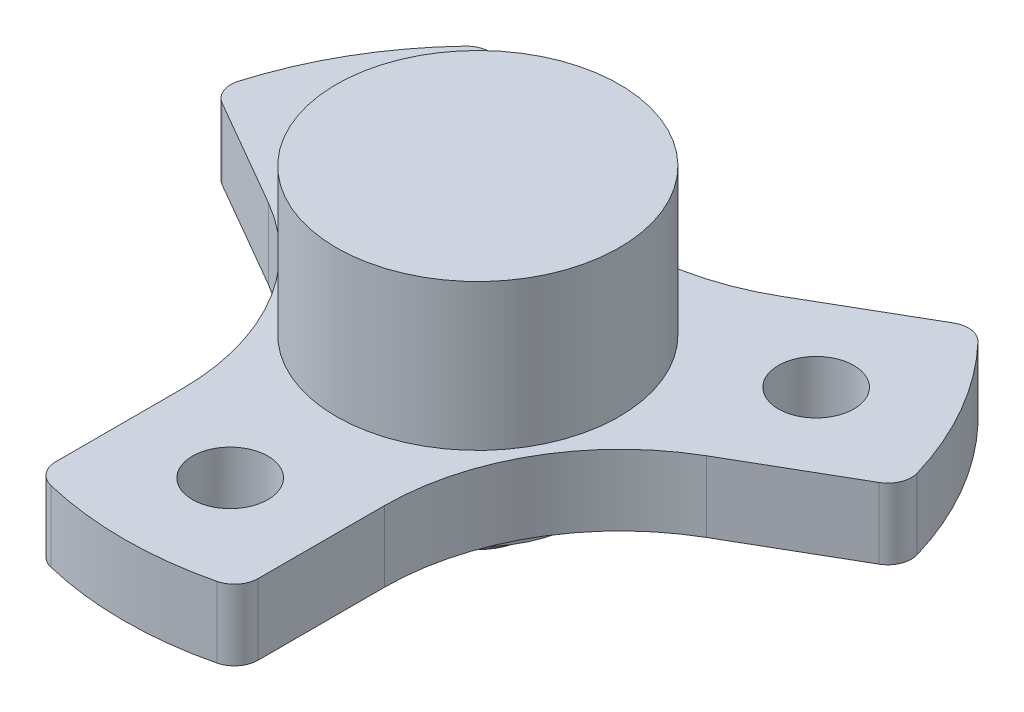
ISO-10303-21;
HEADER;
FILE_DESCRIPTION(('STEP AP214'),'2;1');
FILE_NAME('part.step','',(''),(''),'','','');
FILE_SCHEMA(('AUTOMOTIVE_DESIGN { 1 0 10303 214 1 1 1 1 }'));
ENDSEC;
DATA;
#1=APPLICATION_CONTEXT('core data for automotive mechanical design processes');
#2=APPLICATION_PROTOCOL_DEFINITION('international standard','automotive_design',2000,#1);
#3=PRODUCT_CONTEXT('',#1,'mechanical');
#4=PRODUCT('Part','Part','',(#3));
#5=PRODUCT_RELATED_PRODUCT_CATEGORY('part','',(#4));
#6=PRODUCT_DEFINITION_FORMATION('','',#4);
#7=PRODUCT_DEFINITION_CONTEXT('part definition',#1,'design');
#8=PRODUCT_DEFINITION('design','',#6,#7);
#9=PRODUCT_DEFINITION_SHAPE('','',#8);
#10=(LENGTH_UNIT() NAMED_UNIT(*) SI_UNIT(.MILLI.,.METRE.));
#11=(NAMED_UNIT(*) PLANE_ANGLE_UNIT() SI_UNIT($,.RADIAN.));
#12=(NAMED_UNIT(*) SI_UNIT($,.STERADIAN.) SOLID_ANGLE_UNIT());
#13=UNCERTAINTY_MEASURE_WITH_UNIT(LENGTH_MEASURE(1.E-05),#10,'distance_accuracy_value','');
#14=(GEOMETRIC_REPRESENTATION_CONTEXT(3) GLOBAL_UNCERTAINTY_ASSIGNED_CONTEXT((#13)) GLOBAL_UNIT_ASSIGNED_CONTEXT((#10,
#11,#12)) REPRESENTATION_CONTEXT('',''));
#15=CARTESIAN_POINT('',(0.,0.,0.));
#16=DIRECTION('',(0.,0.,1.));
#17=DIRECTION('',(1.,0.,0.));
#18=AXIS2_PLACEMENT_3D('',#15,#16,#17);
#19=CARTESIAN_POINT('',(-11.41,4.6,12.3057899789387));
#20=DIRECTION('',(0.,-1.,0.));
#21=DIRECTION('',(0.,0.,-1.));
#22=AXIS2_PLACEMENT_3D('',#19,#20,#21);
#23=PLANE('',#22);
#24=CARTESIAN_POINT('',(0.,4.6,0.));
#25=DIRECTION('',(0.,1.,0.));
#26=DIRECTION('',(0.,0.,1.));
#27=AXIS2_PLACEMENT_3D('',#24,#25,#26);
#28=CIRCLE('',#27,3.);
#29=CARTESIAN_POINT('',(0.,4.6,3.));
#30=VERTEX_POINT('',#29);
#31=EDGE_CURVE('E39',#30,#30,#28,.F.);
#32=ORIENTED_EDGE('',*,*,#31,.F.);
#33=EDGE_LOOP('',(#32));
#34=FACE_BOUND('',#33,.T.);
#35=ADVANCED_FACE('F36',(#34),#23,.F.);
#36=CARTESIAN_POINT('',(0.,-1.7,0.));
#37=DIRECTION('',(0.,-1.,0.));
#38=DIRECTION('',(0.,0.,-1.));
#39=AXIS2_PLACEMENT_3D('',#36,#37,#38);
#40=PLANE('',#39);
#41=CARTESIAN_POINT('',(0.,-1.7,0.));
#42=DIRECTION('',(0.,-1.,0.));
#43=DIRECTION('',(0.,0.,-1.));
#44=AXIS2_PLACEMENT_3D('',#41,#42,#43);
#45=CIRCLE('',#44,1.05);
#46=CARTESIAN_POINT('',(0.,-1.7,-1.05));
#47=VERTEX_POINT('',#46);
#48=EDGE_CURVE('E300',#47,#47,#45,.T.);
#49=ORIENTED_EDGE('',*,*,#48,.T.);
#50=EDGE_LOOP('',(#49));
#51=FACE_BOUND('',#50,.T.);
#52=ADVANCED_FACE('F399',(#51),#40,.T.);
#53=CARTESIAN_POINT('',(0.,-1.7,0.));
#54=DIRECTION('',(0.,1.,0.));
#55=DIRECTION('',(0.,0.,1.));
#56=AXIS2_PLACEMENT_3D('',#53,#54,#55);
#57=CONICAL_SURFACE('',#56,1.05,0.785398163397438);
#58=CARTESIAN_POINT('',(0.,-1.5,0.));
#59=DIRECTION('',(0.,-1.,0.));
#60=DIRECTION('',(0.,0.,-1.));
#61=AXIS2_PLACEMENT_3D('',#58,#59,#60);
#62=CIRCLE('',#61,1.25);
#63=CARTESIAN_POINT('',(0.,-1.5,-1.25));
#64=VERTEX_POINT('',#63);
#65=EDGE_CURVE('E303',#64,#64,#62,.F.);
#66=ORIENTED_EDGE('',*,*,#65,.F.);
#67=EDGE_LOOP('',(#66));
#68=FACE_BOUND('',#67,.T.);
#69=ORIENTED_EDGE('',*,*,#48,.F.);
#70=EDGE_LOOP('',(#69));
#71=FACE_BOUND('',#70,.T.);
#72=ADVANCED_FACE('F404',(#68,#71),#57,.T.);
#73=CARTESIAN_POINT('',(0.,-0.8,0.));
#74=DIRECTION('',(0.,-1.,0.));
#75=DIRECTION('',(0.,0.,-1.));
#76=AXIS2_PLACEMENT_3D('',#73,#74,#75);
#77=PLANE('',#76);
#78=CARTESIAN_POINT('',(0.,-0.8,0.));
#79=DIRECTION('',(0.,-1.,0.));
#80=DIRECTION('',(0.,0.,-1.));
#81=AXIS2_PLACEMENT_3D('',#78,#79,#80);
#82=CIRCLE('',#81,1.25);
#83=CARTESIAN_POINT('',(0.555555555555556,-0.8,-1.11975802059702));
#84=VERTEX_POINT('',#83);
#85=CARTESIAN_POINT('',(-0.555555555555556,-0.8,-1.11975802059702));
#86=VERTEX_POINT('',#85);
#87=EDGE_CURVE('E306',#84,#86,#82,.T.);
#88=ORIENTED_EDGE('',*,*,#87,.F.);
#89=DIRECTION('',(0.444444444444444,0.,-0.895806416477617));
#90=VECTOR('',#89,1.);
#91=CARTESIAN_POINT('',(1.,-0.8,-2.01556443707464));
#92=LINE('',#91,#90);
#93=CARTESIAN_POINT('',(1.,-0.8,-2.01556443707464));
#94=VERTEX_POINT('',#93);
#95=EDGE_CURVE('E267',#84,#94,#92,.T.);
#96=ORIENTED_EDGE('',*,*,#95,.T.);
#97=CARTESIAN_POINT('',(0.,-0.8,0.));
#98=DIRECTION('',(0.,-1.,0.));
#99=DIRECTION('',(0.,0.,-1.));
#100=AXIS2_PLACEMENT_3D('',#97,#98,#99);
#101=CIRCLE('',#100,2.25);
#102=CARTESIAN_POINT('',(-1.,-0.8,-2.01556443707464));
#103=VERTEX_POINT('',#102);
#104=EDGE_CURVE('E270',#94,#103,#101,.T.);
#105=ORIENTED_EDGE('',*,*,#104,.T.);
#106=DIRECTION('',(0.444444444444444,0.,0.895806416477617));
#107=VECTOR('',#106,1.);
#108=CARTESIAN_POINT('',(0.,-0.8,0.));
#109=LINE('',#108,#107);
#110=EDGE_CURVE('E272',#103,#86,#109,.T.);
#111=ORIENTED_EDGE('',*,*,#110,.T.);
#112=EDGE_LOOP('',(#88,#96,#105,#111));
#113=FACE_BOUND('',#112,.T.);
#114=ADVANCED_FACE('F480',(#113),#77,.T.);
#115=CARTESIAN_POINT('',(0.,-0.8,0.));
#116=DIRECTION('',(0.,1.,0.));
#117=DIRECTION('',(0.,0.,1.));
#118=AXIS2_PLACEMENT_3D('',#115,#116,#117);
#119=CYLINDRICAL_SURFACE('',#118,2.25);
#120=CARTESIAN_POINT('',(0.,0.,0.));
#121=DIRECTION('',(0.,-1.,0.));
#122=DIRECTION('',(0.,0.,-1.));
#123=AXIS2_PLACEMENT_3D('',#120,#121,#122);
#124=CIRCLE('',#123,2.25);
#125=CARTESIAN_POINT('',(1.,0.,-2.01556443707464));
#126=VERTEX_POINT('',#125);
#127=CARTESIAN_POINT('',(-1.,0.,-2.01556443707464));
#128=VERTEX_POINT('',#127);
#129=EDGE_CURVE('E276',#126,#128,#124,.T.);
#130=ORIENTED_EDGE('',*,*,#129,.T.);
#131=DIRECTION('',(0.,1.,0.));
#132=VECTOR('',#131,1.);
#133=CARTESIAN_POINT('',(-1.,-0.8,-2.01556443707464));
#134=LINE('',#133,#132);
#135=EDGE_CURVE('E274',#103,#128,#134,.T.);
#136=ORIENTED_EDGE('',*,*,#135,.F.);
#137=ORIENTED_EDGE('',*,*,#104,.F.);
#138=DIRECTION('',(0.,1.,0.));
#139=VECTOR('',#138,1.);
#140=CARTESIAN_POINT('',(1.,-0.8,-2.01556443707464));
#141=LINE('',#140,#139);
#142=EDGE_CURVE('E281',#94,#126,#141,.T.);
#143=ORIENTED_EDGE('',*,*,#142,.T.);
#144=EDGE_LOOP('',(#130,#136,#137,#143));
#145=FACE_BOUND('',#144,.T.);
#146=ADVANCED_FACE('F501',(#145),#119,.T.);
#147=CARTESIAN_POINT('',(0.,-0.8,0.));
#148=DIRECTION('',(-0.895806416477617,0.,0.444444444444444));
#149=DIRECTION('',(0.444444444444444,0.,0.895806416477617));
#150=AXIS2_PLACEMENT_3D('',#147,#148,#149);
#151=PLANE('',#150);
#152=DIRECTION('',(0.444444444444444,0.,0.895806416477617));
#153=VECTOR('',#152,1.);
#154=CARTESIAN_POINT('',(0.,0.,0.));
#155=LINE('',#154,#153);
#156=CARTESIAN_POINT('',(-0.555555555555556,0.,-1.11975802059702));
#157=VERTEX_POINT('',#156);
#158=EDGE_CURVE('E269',#128,#157,#155,.T.);
#159=ORIENTED_EDGE('',*,*,#158,.T.);
#160=DIRECTION('',(0.,1.,0.));
#161=VECTOR('',#160,1.);
#162=CARTESIAN_POINT('',(-0.555555555555556,-1.7,-1.11975802059702));
#163=LINE('',#162,#161);
#164=EDGE_CURVE('E309',#157,#86,#163,.F.);
#165=ORIENTED_EDGE('',*,*,#164,.T.);
#166=ORIENTED_EDGE('',*,*,#110,.F.);
#167=ORIENTED_EDGE('',*,*,#135,.T.);
#168=EDGE_LOOP('',(#159,#165,#166,#167));
#169=FACE_BOUND('',#168,.T.);
#170=ADVANCED_FACE('F495',(#169),#151,.F.);
#171=CARTESIAN_POINT('',(0.,-1.7,0.));
#172=DIRECTION('',(0.,1.,0.));
#173=DIRECTION('',(0.,0.,1.));
#174=AXIS2_PLACEMENT_3D('',#171,#172,#173);
#175=CYLINDRICAL_SURFACE('',#174,1.25);
#176=ORIENTED_EDGE('',*,*,#65,.T.);
#177=EDGE_LOOP('',(#176));
#178=FACE_BOUND('',#177,.T.);
#179=DIRECTION('',(0.,1.,0.));
#180=VECTOR('',#179,1.);
#181=CARTESIAN_POINT('',(0.555555555555556,-1.7,-1.11975802059702));
#182=LINE('',#181,#180);
#183=CARTESIAN_POINT('',(0.555555555555556,0.,-1.11975802059702));
#184=VERTEX_POINT('',#183);
#185=EDGE_CURVE('E312',#84,#184,#182,.T.);
#186=ORIENTED_EDGE('',*,*,#185,.F.);
#187=ORIENTED_EDGE('',*,*,#87,.T.);
#188=ORIENTED_EDGE('',*,*,#164,.F.);
#189=CARTESIAN_POINT('',(0.,0.,0.));
#190=DIRECTION('',(0.,1.,0.));
#191=DIRECTION('',(0.,0.,1.));
#192=AXIS2_PLACEMENT_3D('',#189,#190,#191);
#193=CIRCLE('',#192,1.25);
#194=EDGE_CURVE('E288',#157,#184,#193,.F.);
#195=ORIENTED_EDGE('',*,*,#194,.T.);
#196=EDGE_LOOP('',(#186,#187,#188,#195));
#197=FACE_BOUND('',#196,.T.);
#198=ADVANCED_FACE('F493',(#178,#197),#175,.T.);
#199=CARTESIAN_POINT('',(1.,-0.8,-2.01556443707464));
#200=DIRECTION('',(0.895806416477617,0.,0.444444444444444));
#201=DIRECTION('',(0.444444444444444,0.,-0.895806416477617));
#202=AXIS2_PLACEMENT_3D('',#199,#200,#201);
#203=PLANE('',#202);
#204=ORIENTED_EDGE('',*,*,#95,.F.);
#205=ORIENTED_EDGE('',*,*,#185,.T.);
#206=DIRECTION('',(0.444444444444444,0.,-0.895806416477617));
#207=VECTOR('',#206,1.);
#208=CARTESIAN_POINT('',(1.,0.,-2.01556443707464));
#209=LINE('',#208,#207);
#210=EDGE_CURVE('E266',#184,#126,#209,.T.);
#211=ORIENTED_EDGE('',*,*,#210,.T.);
#212=ORIENTED_EDGE('',*,*,#142,.F.);
#213=EDGE_LOOP('',(#204,#205,#211,#212));
#214=FACE_BOUND('',#213,.T.);
#215=ADVANCED_FACE('F486',(#214),#203,.F.);
#216=CARTESIAN_POINT('',(0.,0.,0.));
#217=DIRECTION('',(0.,1.,0.));
#218=DIRECTION('',(0.,0.,1.));
#219=AXIS2_PLACEMENT_3D('',#216,#217,#218);
#220=PLANE('',#219);
#221=CARTESIAN_POINT('',(0.,0.,5.25));
#222=DIRECTION('',(0.,-1.,0.));
#223=DIRECTION('',(0.,0.,-1.));
#224=AXIS2_PLACEMENT_3D('',#221,#222,#223);
#225=CIRCLE('',#224,0.799999999999988);
#226=CARTESIAN_POINT('',(0.,0.,4.45000000000001));
#227=VERTEX_POINT('',#226);
#228=EDGE_CURVE('E254',#227,#227,#225,.T.);
#229=ORIENTED_EDGE('',*,*,#228,.F.);
#230=EDGE_LOOP('',(#229));
#231=FACE_BOUND('',#230,.T.);
#232=ORIENTED_EDGE('',*,*,#210,.F.);
#233=ORIENTED_EDGE('',*,*,#194,.F.);
#234=ORIENTED_EDGE('',*,*,#158,.F.);
#235=ORIENTED_EDGE('',*,*,#129,.F.);
#236=EDGE_LOOP('',(#232,#233,#234,#235));
#237=FACE_BOUND('',#236,.T.);
#238=CARTESIAN_POINT('',(4.54663336986831,0.,-2.625));
#239=DIRECTION('',(0.,-1.,0.));
#240=DIRECTION('',(0.,0.,-1.));
#241=AXIS2_PLACEMENT_3D('',#238,#239,#240);
#242=CIRCLE('',#241,0.799999999999988);
#243=CARTESIAN_POINT('',(4.54663336986831,0.,-3.42499999999999));
#244=VERTEX_POINT('',#243);
#245=EDGE_CURVE('E260',#244,#244,#242,.T.);
#246=ORIENTED_EDGE('',*,*,#245,.F.);
#247=EDGE_LOOP('',(#246));
#248=FACE_BOUND('',#247,.T.);
#249=CARTESIAN_POINT('',(-4.54663336986831,0.,-2.625));
#250=DIRECTION('',(0.,-1.,0.));
#251=DIRECTION('',(0.,0.,-1.));
#252=AXIS2_PLACEMENT_3D('',#249,#250,#251);
#253=CIRCLE('',#252,0.799999999999988);
#254=CARTESIAN_POINT('',(-4.54663336986831,0.,-3.42499999999999));
#255=VERTEX_POINT('',#254);
#256=EDGE_CURVE('E248',#255,#255,#253,.T.);
#257=ORIENTED_EDGE('',*,*,#256,.F.);
#258=EDGE_LOOP('',(#257));
#259=FACE_BOUND('',#258,.T.);
#260=CARTESIAN_POINT('',(0.,0.,0.));
#261=DIRECTION('',(0.,1.,0.));
#262=DIRECTION('',(0.,0.,1.));
#263=AXIS2_PLACEMENT_3D('',#260,#261,#262);
#264=CIRCLE('',#263,7.5);
#265=CARTESIAN_POINT('',(7.19445468678419,0.,-2.11891995125087));
#266=VERTEX_POINT('',#265);
#267=CARTESIAN_POINT('',(5.43226584976103,0.,-5.17112054950569));
#268=VERTEX_POINT('',#267);
#269=EDGE_CURVE('E297',#266,#268,#264,.T.);
#270=ORIENTED_EDGE('',*,*,#269,.F.);
#271=CARTESIAN_POINT('',(6.71482437433191,0.,-1.97765862116748));
#272=DIRECTION('',(0.,1.,0.));
#273=DIRECTION('',(0.,0.,1.));
#274=AXIS2_PLACEMENT_3D('',#271,#272,#273);
#275=CIRCLE('',#274,0.5);
#276=CARTESIAN_POINT('',(6.96482437433191,0.,-1.54464591927527));
#277=VERTEX_POINT('',#276);
#278=EDGE_CURVE('E355',#266,#277,#275,.F.);
#279=ORIENTED_EDGE('',*,*,#278,.T.);
#280=DIRECTION('',(-0.866025403784439,0.,0.5));
#281=VECTOR('',#280,1.);
#282=CARTESIAN_POINT('',(4.64470958122163,0.,-0.20512701892221));
#283=LINE('',#282,#281);
#284=CARTESIAN_POINT('',(4.64470958122163,0.,-0.20512701892221));
#285=VERTEX_POINT('',#284);
#286=EDGE_CURVE('E11',#277,#285,#283,.T.);
#287=ORIENTED_EDGE('',*,*,#286,.T.);
#288=CARTESIAN_POINT('',(7.14470958122163,0.,4.125));
#289=DIRECTION('',(0.,-1.,0.));
#290=DIRECTION('',(0.,0.,-1.));
#291=AXIS2_PLACEMENT_3D('',#288,#289,#290);
#292=CIRCLE('',#291,5.);
#293=CARTESIAN_POINT('',(2.14470958122163,0.,4.125));
#294=VERTEX_POINT('',#293);
#295=EDGE_CURVE('E238',#294,#285,#292,.T.);
#296=ORIENTED_EDGE('',*,*,#295,.F.);
#297=DIRECTION('',(0.,0.,1.));
#298=VECTOR('',#297,1.);
#299=CARTESIAN_POINT('',(2.14470958122163,0.,4.125));
#300=LINE('',#299,#298);
#301=CARTESIAN_POINT('',(2.14470958122163,0.,6.80403780070612));
#302=VERTEX_POINT('',#301);
#303=EDGE_CURVE('E215',#294,#302,#300,.T.);
#304=ORIENTED_EDGE('',*,*,#303,.T.);
#305=CARTESIAN_POINT('',(1.64470958122163,0.,6.80403780070612));
#306=DIRECTION('',(0.,1.,0.));
#307=DIRECTION('',(0.,0.,1.));
#308=AXIS2_PLACEMENT_3D('',#305,#306,#307);
#309=CIRCLE('',#308,0.5);
#310=CARTESIAN_POINT('',(1.76218883702318,0.,7.29004050075656));
#311=VERTEX_POINT('',#310);
#312=EDGE_CURVE('E353',#302,#311,#309,.F.);
#313=ORIENTED_EDGE('',*,*,#312,.T.);
#314=CARTESIAN_POINT('',(-1.76218883702318,0.,7.29004050075656));
#315=VERTEX_POINT('',#314);
#316=EDGE_CURVE('E296',#315,#311,#264,.T.);
#317=ORIENTED_EDGE('',*,*,#316,.F.);
#318=CARTESIAN_POINT('',(-1.64470958122163,0.,6.80403780070612));
#319=DIRECTION('',(0.,1.,0.));
#320=DIRECTION('',(0.,0.,1.));
#321=AXIS2_PLACEMENT_3D('',#318,#319,#320);
#322=CIRCLE('',#321,0.5);
#323=CARTESIAN_POINT('',(-2.14470958122163,0.,6.80403780070612));
#324=VERTEX_POINT('',#323);
#325=EDGE_CURVE('E351',#315,#324,#322,.F.);
#326=ORIENTED_EDGE('',*,*,#325,.T.);
#327=DIRECTION('',(0.,0.,-1.));
#328=VECTOR('',#327,1.);
#329=CARTESIAN_POINT('',(-2.14470958122163,0.,11.4));
#330=LINE('',#329,#328);
#331=CARTESIAN_POINT('',(-2.14470958122163,0.,4.125));
#332=VERTEX_POINT('',#331);
#333=EDGE_CURVE('E213',#324,#332,#330,.T.);
#334=ORIENTED_EDGE('',*,*,#333,.T.);
#335=CARTESIAN_POINT('',(-7.14470958122163,0.,4.125));
#336=DIRECTION('',(0.,-1.,0.));
#337=DIRECTION('',(0.,0.,-1.));
#338=AXIS2_PLACEMENT_3D('',#335,#336,#337);
#339=CIRCLE('',#338,5.);
#340=CARTESIAN_POINT('',(-4.64470958122163,0.,-0.205127018922209));
#341=VERTEX_POINT('',#340);
#342=EDGE_CURVE('E232',#341,#332,#339,.T.);
#343=ORIENTED_EDGE('',*,*,#342,.F.);
#344=DIRECTION('',(-0.866025403784439,0.,-0.5));
#345=VECTOR('',#344,1.);
#346=CARTESIAN_POINT('',(-4.64470958122163,0.,-0.20512701892221));
#347=LINE('',#346,#345);
#348=CARTESIAN_POINT('',(-6.96482437433191,0.,-1.54464591927527));
#349=VERTEX_POINT('',#348);
#350=EDGE_CURVE('E208',#341,#349,#347,.T.);
#351=ORIENTED_EDGE('',*,*,#350,.T.);
#352=CARTESIAN_POINT('',(-6.71482437433191,0.,-1.97765862116748));
#353=DIRECTION('',(0.,1.,0.));
#354=DIRECTION('',(0.,0.,1.));
#355=AXIS2_PLACEMENT_3D('',#352,#353,#354);
#356=CIRCLE('',#355,0.5);
#357=CARTESIAN_POINT('',(-7.19445468678419,0.,-2.11891995125087));
#358=VERTEX_POINT('',#357);
#359=EDGE_CURVE('E349',#349,#358,#356,.F.);
#360=ORIENTED_EDGE('',*,*,#359,.T.);
#361=CARTESIAN_POINT('',(-5.43226584976103,0.,-5.17112054950569));
#362=VERTEX_POINT('',#361);
#363=EDGE_CURVE('E293',#362,#358,#264,.T.);
#364=ORIENTED_EDGE('',*,*,#363,.F.);
#365=CARTESIAN_POINT('',(-5.0701147931103,0.,-4.82637917953865));
#366=DIRECTION('',(0.,1.,0.));
#367=DIRECTION('',(0.,0.,1.));
#368=AXIS2_PLACEMENT_3D('',#365,#366,#367);
#369=CIRCLE('',#368,0.5);
#370=CARTESIAN_POINT('',(-4.8201147931103,0.,-5.25939188143087));
#371=VERTEX_POINT('',#370);
#372=EDGE_CURVE('E194',#362,#371,#369,.F.);
#373=ORIENTED_EDGE('',*,*,#372,.T.);
#374=DIRECTION('',(0.866025403784439,0.,0.5));
#375=VECTOR('',#374,1.);
#376=CARTESIAN_POINT('',(-8.80033481253179,0.,-7.55737298107781));
#377=LINE('',#376,#375);
#378=CARTESIAN_POINT('',(-2.5,0.,-3.91987298107781));
#379=VERTEX_POINT('',#378);
#380=EDGE_CURVE('E56',#371,#379,#377,.T.);
#381=ORIENTED_EDGE('',*,*,#380,.T.);
#382=CARTESIAN_POINT('',(0.,0.,-8.25));
#383=DIRECTION('',(0.,-1.,0.));
#384=DIRECTION('',(0.,0.,-1.));
#385=AXIS2_PLACEMENT_3D('',#382,#383,#384);
#386=CIRCLE('',#385,5.);
#387=CARTESIAN_POINT('',(2.5,0.,-3.91987298107781));
#388=VERTEX_POINT('',#387);
#389=EDGE_CURVE('E206',#388,#379,#386,.T.);
#390=ORIENTED_EDGE('',*,*,#389,.F.);
#391=DIRECTION('',(0.866025403784439,0.,-0.5));
#392=VECTOR('',#391,1.);
#393=CARTESIAN_POINT('',(8.62404483033934,0.,-7.45559191240356));
#394=LINE('',#393,#392);
#395=CARTESIAN_POINT('',(4.8201147931103,0.,-5.25939188143087));
#396=VERTEX_POINT('',#395);
#397=EDGE_CURVE('E44',#388,#396,#394,.T.);
#398=ORIENTED_EDGE('',*,*,#397,.T.);
#399=CARTESIAN_POINT('',(5.0701147931103,0.,-4.82637917953865));
#400=DIRECTION('',(0.,1.,0.));
#401=DIRECTION('',(0.,0.,1.));
#402=AXIS2_PLACEMENT_3D('',#399,#400,#401);
#403=CIRCLE('',#402,0.5);
#404=EDGE_CURVE('E184',#396,#268,#403,.F.);
#405=ORIENTED_EDGE('',*,*,#404,.T.);
#406=EDGE_LOOP('',(#270,#279,#287,#296,#304,#313,#317,#326,#334,#343,#351,#360,#364,#373,#381,
#390,#398,#405));
#407=FACE_BOUND('',#406,.T.);
#408=ADVANCED_FACE('F204',(#231,#237,#248,#259,#407),#220,.F.);
#409=CARTESIAN_POINT('',(7.14470958122163,15.801,4.125));
#410=DIRECTION('',(0.,-1.,0.));
#411=DIRECTION('',(0.,0.,-1.));
#412=AXIS2_PLACEMENT_3D('',#409,#410,#411);
#413=CYLINDRICAL_SURFACE('',#412,5.);
#414=ORIENTED_EDGE('',*,*,#295,.T.);
#415=DIRECTION('',(0.,-1.,0.));
#416=VECTOR('',#415,1.);
#417=CARTESIAN_POINT('',(4.64470958122163,15.801,-0.20512701892221));
#418=LINE('',#417,#416);
#419=CARTESIAN_POINT('',(4.64470958122163,1.5,-0.20512701892221));
#420=VERTEX_POINT('',#419);
#421=EDGE_CURVE('E323',#285,#420,#418,.F.);
#422=ORIENTED_EDGE('',*,*,#421,.T.);
#423=CARTESIAN_POINT('',(7.14470958122163,1.5,4.125));
#424=DIRECTION('',(0.,1.,0.));
#425=DIRECTION('',(0.,0.,1.));
#426=AXIS2_PLACEMENT_3D('',#423,#424,#425);
#427=CIRCLE('',#426,5.);
#428=CARTESIAN_POINT('',(2.14470958122163,1.5,4.125));
#429=VERTEX_POINT('',#428);
#430=EDGE_CURVE('E241',#429,#420,#427,.F.);
#431=ORIENTED_EDGE('',*,*,#430,.F.);
#432=DIRECTION('',(0.,-1.,0.));
#433=VECTOR('',#432,1.);
#434=CARTESIAN_POINT('',(2.14470958122163,15.801,4.125));
#435=LINE('',#434,#433);
#436=EDGE_CURVE('E320',#294,#429,#435,.F.);
#437=ORIENTED_EDGE('',*,*,#436,.F.);
#438=EDGE_LOOP('',(#414,#422,#431,#437));
#439=FACE_BOUND('',#438,.T.);
#440=ADVANCED_FACE('F429',(#439),#413,.F.);
#441=CARTESIAN_POINT('',(2.14470958122163,37.1665099143276,4.125));
#442=DIRECTION('',(1.,0.,0.));
#443=DIRECTION('',(0.,0.,-1.));
#444=AXIS2_PLACEMENT_3D('',#441,#442,#443);
#445=PLANE('',#444);
#446=DIRECTION('',(0.,0.,-1.));
#447=VECTOR('',#446,1.);
#448=CARTESIAN_POINT('',(2.14470958122163,1.5,0.));
#449=LINE('',#448,#447);
#450=CARTESIAN_POINT('',(2.14470958122163,1.5,6.80403780070612));
#451=VERTEX_POINT('',#450);
#452=EDGE_CURVE('E223',#451,#429,#449,.T.);
#453=ORIENTED_EDGE('',*,*,#452,.F.);
#454=DIRECTION('',(0.,1.,0.));
#455=VECTOR('',#454,1.);
#456=CARTESIAN_POINT('',(2.14470958122163,0.,6.80403780070612));
#457=LINE('',#456,#455);
#458=EDGE_CURVE('E357',#451,#302,#457,.F.);
#459=ORIENTED_EDGE('',*,*,#458,.T.);
#460=ORIENTED_EDGE('',*,*,#303,.F.);
#461=ORIENTED_EDGE('',*,*,#436,.T.);
#462=EDGE_LOOP('',(#453,#459,#460,#461));
#463=FACE_BOUND('',#462,.T.);
#464=ADVANCED_FACE('F425',(#463),#445,.T.);
#465=CARTESIAN_POINT('',(1.64470958122163,1.5,6.80403780070612));
#466=DIRECTION('',(0.,-1.,0.));
#467=DIRECTION('',(0.,0.,-1.));
#468=AXIS2_PLACEMENT_3D('',#465,#466,#467);
#469=CYLINDRICAL_SURFACE('',#468,0.5);
#470=CARTESIAN_POINT('',(1.64470958122163,1.5,6.80403780070612));
#471=DIRECTION('',(0.,1.,0.));
#472=DIRECTION('',(0.,0.,1.));
#473=AXIS2_PLACEMENT_3D('',#470,#471,#472);
#474=CIRCLE('',#473,0.5);
#475=CARTESIAN_POINT('',(1.76218883702318,1.5,7.29004050075656));
#476=VERTEX_POINT('',#475);
#477=EDGE_CURVE('E342',#476,#451,#474,.T.);
#478=ORIENTED_EDGE('',*,*,#477,.F.);
#479=DIRECTION('',(0.,-1.,0.));
#480=VECTOR('',#479,1.);
#481=CARTESIAN_POINT('',(1.76218883702318,1.5,7.29004050075656));
#482=LINE('',#481,#480);
#483=EDGE_CURVE('E362',#311,#476,#482,.F.);
#484=ORIENTED_EDGE('',*,*,#483,.F.);
#485=ORIENTED_EDGE('',*,*,#312,.F.);
#486=ORIENTED_EDGE('',*,*,#458,.F.);
#487=EDGE_LOOP('',(#478,#484,#485,#486));
#488=FACE_BOUND('',#487,.T.);
#489=ADVANCED_FACE('F421',(#488),#469,.T.);
#490=CARTESIAN_POINT('',(0.,1.5,0.));
#491=DIRECTION('',(0.,-1.,0.));
#492=DIRECTION('',(0.,0.,-1.));
#493=AXIS2_PLACEMENT_3D('',#490,#491,#492);
#494=CYLINDRICAL_SURFACE('',#493,7.5);
#495=ORIENTED_EDGE('',*,*,#316,.T.);
#496=ORIENTED_EDGE('',*,*,#483,.T.);
#497=CARTESIAN_POINT('',(0.,1.5,0.));
#498=DIRECTION('',(0.,1.,0.));
#499=DIRECTION('',(0.,0.,1.));
#500=AXIS2_PLACEMENT_3D('',#497,#498,#499);
#501=CIRCLE('',#500,7.5);
#502=CARTESIAN_POINT('',(-1.76218883702318,1.5,7.29004050075656));
#503=VERTEX_POINT('',#502);
#504=EDGE_CURVE('E289',#503,#476,#501,.T.);
#505=ORIENTED_EDGE('',*,*,#504,.F.);
#506=DIRECTION('',(0.,-1.,0.));
#507=VECTOR('',#506,1.);
#508=CARTESIAN_POINT('',(-1.76218883702318,1.5,7.29004050075656));
#509=LINE('',#508,#507);
#510=EDGE_CURVE('E360',#503,#315,#509,.T.);
#511=ORIENTED_EDGE('',*,*,#510,.T.);
#512=EDGE_LOOP('',(#495,#496,#505,#511));
#513=FACE_BOUND('',#512,.T.);
#514=ADVANCED_FACE('F415',(#513),#494,.T.);
#515=CARTESIAN_POINT('',(-1.64470958122163,1.5,6.80403780070612));
#516=DIRECTION('',(0.,-1.,0.));
#517=DIRECTION('',(0.,0.,-1.));
#518=AXIS2_PLACEMENT_3D('',#515,#516,#517);
#519=CYLINDRICAL_SURFACE('',#518,0.5);
#520=ORIENTED_EDGE('',*,*,#325,.F.);
#521=ORIENTED_EDGE('',*,*,#510,.F.);
#522=CARTESIAN_POINT('',(-1.64470958122163,1.5,6.80403780070612));
#523=DIRECTION('',(0.,1.,0.));
#524=DIRECTION('',(0.,0.,1.));
#525=AXIS2_PLACEMENT_3D('',#522,#523,#524);
#526=CIRCLE('',#525,0.5);
#527=CARTESIAN_POINT('',(-2.14470958122163,1.5,6.80403780070612));
#528=VERTEX_POINT('',#527);
#529=EDGE_CURVE('E340',#528,#503,#526,.T.);
#530=ORIENTED_EDGE('',*,*,#529,.F.);
#531=DIRECTION('',(0.,1.,0.));
#532=VECTOR('',#531,1.);
#533=CARTESIAN_POINT('',(-2.14470958122163,1.5,6.80403780070612));
#534=LINE('',#533,#532);
#535=EDGE_CURVE('E364',#324,#528,#534,.T.);
#536=ORIENTED_EDGE('',*,*,#535,.F.);
#537=EDGE_LOOP('',(#520,#521,#530,#536));
#538=FACE_BOUND('',#537,.T.);
#539=ADVANCED_FACE('F462',(#538),#519,.T.);
#540=CARTESIAN_POINT('',(-2.14470958122163,37.1665099143276,11.4));
#541=DIRECTION('',(-1.,0.,0.));
#542=DIRECTION('',(0.,0.,1.));
#543=AXIS2_PLACEMENT_3D('',#540,#541,#542);
#544=PLANE('',#543);
#545=ORIENTED_EDGE('',*,*,#333,.F.);
#546=ORIENTED_EDGE('',*,*,#535,.T.);
#547=DIRECTION('',(0.,0.,1.));
#548=VECTOR('',#547,1.);
#549=CARTESIAN_POINT('',(-2.14470958122163,1.5,0.));
#550=LINE('',#549,#548);
#551=CARTESIAN_POINT('',(-2.14470958122163,1.5,4.125));
#552=VERTEX_POINT('',#551);
#553=EDGE_CURVE('E218',#552,#528,#550,.T.);
#554=ORIENTED_EDGE('',*,*,#553,.F.);
#555=DIRECTION('',(0.,-1.,0.));
#556=VECTOR('',#555,1.);
#557=CARTESIAN_POINT('',(-2.14470958122163,15.801,4.125));
#558=LINE('',#557,#556);
#559=EDGE_CURVE('E314',#332,#552,#558,.F.);
#560=ORIENTED_EDGE('',*,*,#559,.F.);
#561=EDGE_LOOP('',(#545,#546,#554,#560));
#562=FACE_BOUND('',#561,.T.);
#563=ADVANCED_FACE('F459',(#562),#544,.T.);
#564=CARTESIAN_POINT('',(-7.14470958122163,15.801,4.125));
#565=DIRECTION('',(0.,-1.,0.));
#566=DIRECTION('',(0.,0.,-1.));
#567=AXIS2_PLACEMENT_3D('',#564,#565,#566);
#568=CYLINDRICAL_SURFACE('',#567,5.);
#569=DIRECTION('',(0.,-1.,0.));
#570=VECTOR('',#569,1.);
#571=CARTESIAN_POINT('',(-4.64470958122163,15.801,-0.205127018922209));
#572=LINE('',#571,#570);
#573=CARTESIAN_POINT('',(-4.64470958122163,1.5,-0.20512701892221));
#574=VERTEX_POINT('',#573);
#575=EDGE_CURVE('E317',#341,#574,#572,.F.);
#576=ORIENTED_EDGE('',*,*,#575,.F.);
#577=ORIENTED_EDGE('',*,*,#342,.T.);
#578=ORIENTED_EDGE('',*,*,#559,.T.);
#579=CARTESIAN_POINT('',(-7.14470958122163,1.5,4.125));
#580=DIRECTION('',(0.,1.,0.));
#581=DIRECTION('',(0.,0.,1.));
#582=AXIS2_PLACEMENT_3D('',#579,#580,#581);
#583=CIRCLE('',#582,5.);
#584=EDGE_CURVE('E235',#574,#552,#583,.F.);
#585=ORIENTED_EDGE('',*,*,#584,.F.);
#586=EDGE_LOOP('',(#576,#577,#578,#585));
#587=FACE_BOUND('',#586,.T.);
#588=ADVANCED_FACE('F456',(#587),#568,.F.);
#589=CARTESIAN_POINT('',(-4.64470958122163,37.1665099143276,-0.20512701892221));
#590=DIRECTION('',(-0.5,0.,0.866025403784439));
#591=DIRECTION('',(0.866025403784439,0.,0.5));
#592=AXIS2_PLACEMENT_3D('',#589,#590,#591);
#593=PLANE('',#592);
#594=DIRECTION('',(0.866025403784439,0.,0.5));
#595=VECTOR('',#594,1.);
#596=CARTESIAN_POINT('',(-1.0723547906108,1.5,1.8573729810778));
#597=LINE('',#596,#595);
#598=CARTESIAN_POINT('',(-6.96482437433191,1.5,-1.54464591927527));
#599=VERTEX_POINT('',#598);
#600=EDGE_CURVE('E221',#599,#574,#597,.T.);
#601=ORIENTED_EDGE('',*,*,#600,.F.);
#602=DIRECTION('',(0.,1.,0.));
#603=VECTOR('',#602,1.);
#604=CARTESIAN_POINT('',(-6.96482437433191,0.,-1.54464591927527));
#605=LINE('',#604,#603);
#606=EDGE_CURVE('E367',#599,#349,#605,.F.);
#607=ORIENTED_EDGE('',*,*,#606,.T.);
#608=ORIENTED_EDGE('',*,*,#350,.F.);
#609=ORIENTED_EDGE('',*,*,#575,.T.);
#610=EDGE_LOOP('',(#601,#607,#608,#609));
#611=FACE_BOUND('',#610,.T.);
#612=ADVANCED_FACE('F449',(#611),#593,.T.);
#613=CARTESIAN_POINT('',(-6.71482437433191,1.5,-1.97765862116748));
#614=DIRECTION('',(0.,-1.,0.));
#615=DIRECTION('',(0.,0.,-1.));
#616=AXIS2_PLACEMENT_3D('',#613,#614,#615);
#617=CYLINDRICAL_SURFACE('',#616,0.5);
#618=CARTESIAN_POINT('',(-6.71482437433191,1.5,-1.97765862116748));
#619=DIRECTION('',(0.,1.,0.));
#620=DIRECTION('',(0.,0.,1.));
#621=AXIS2_PLACEMENT_3D('',#618,#619,#620);
#622=CIRCLE('',#621,0.5);
#623=CARTESIAN_POINT('',(-7.19445468678419,1.5,-2.11891995125087));
#624=VERTEX_POINT('',#623);
#625=EDGE_CURVE('E338',#624,#599,#622,.T.);
#626=ORIENTED_EDGE('',*,*,#625,.F.);
#627=DIRECTION('',(0.,-1.,0.));
#628=VECTOR('',#627,1.);
#629=CARTESIAN_POINT('',(-7.19445468678419,1.5,-2.11891995125087));
#630=LINE('',#629,#628);
#631=EDGE_CURVE('E372',#358,#624,#630,.F.);
#632=ORIENTED_EDGE('',*,*,#631,.F.);
#633=ORIENTED_EDGE('',*,*,#359,.F.);
#634=ORIENTED_EDGE('',*,*,#606,.F.);
#635=EDGE_LOOP('',(#626,#632,#633,#634));
#636=FACE_BOUND('',#635,.T.);
#637=ADVANCED_FACE('F447',(#636),#617,.T.);
#638=ORIENTED_EDGE('',*,*,#363,.T.);
#639=ORIENTED_EDGE('',*,*,#631,.T.);
#640=CARTESIAN_POINT('',(-5.43226584976103,1.5,-5.17112054950569));
#641=VERTEX_POINT('',#640);
#642=EDGE_CURVE('E287',#641,#624,#501,.T.);
#643=ORIENTED_EDGE('',*,*,#642,.F.);
#644=DIRECTION('',(0.,-1.,0.));
#645=VECTOR('',#644,1.);
#646=CARTESIAN_POINT('',(-5.43226584976103,1.5,-5.17112054950569));
#647=LINE('',#646,#645);
#648=EDGE_CURVE('E370',#641,#362,#647,.T.);
#649=ORIENTED_EDGE('',*,*,#648,.T.);
#650=EDGE_LOOP('',(#638,#639,#643,#649));
#651=FACE_BOUND('',#650,.T.);
#652=ADVANCED_FACE('F471',(#651),#494,.T.);
#653=CARTESIAN_POINT('',(-5.0701147931103,1.5,-4.82637917953865));
#654=DIRECTION('',(0.,-1.,0.));
#655=DIRECTION('',(0.,0.,-1.));
#656=AXIS2_PLACEMENT_3D('',#653,#654,#655);
#657=CYLINDRICAL_SURFACE('',#656,0.5);
#658=ORIENTED_EDGE('',*,*,#372,.F.);
#659=ORIENTED_EDGE('',*,*,#648,.F.);
#660=CARTESIAN_POINT('',(-5.0701147931103,1.5,-4.82637917953865));
#661=DIRECTION('',(0.,1.,0.));
#662=DIRECTION('',(0.,0.,1.));
#663=AXIS2_PLACEMENT_3D('',#660,#661,#662);
#664=CIRCLE('',#663,0.5);
#665=CARTESIAN_POINT('',(-4.8201147931103,1.5,-5.25939188143087));
#666=VERTEX_POINT('',#665);
#667=EDGE_CURVE('E336',#666,#641,#664,.T.);
#668=ORIENTED_EDGE('',*,*,#667,.F.);
#669=DIRECTION('',(0.,1.,0.));
#670=VECTOR('',#669,1.);
#671=CARTESIAN_POINT('',(-4.82011479311029,1.5,-5.25939188143087));
#672=LINE('',#671,#670);
#673=EDGE_CURVE('E202',#371,#666,#672,.T.);
#674=ORIENTED_EDGE('',*,*,#673,.F.);
#675=EDGE_LOOP('',(#658,#659,#668,#674));
#676=FACE_BOUND('',#675,.T.);
#677=ADVANCED_FACE('F394',(#676),#657,.T.);
#678=CARTESIAN_POINT('',(-8.80033481253179,37.1665099143276,-7.55737298107781));
#679=DIRECTION('',(0.5,0.,-0.866025403784439));
#680=DIRECTION('',(-0.866025403784439,0.,-0.5));
#681=AXIS2_PLACEMENT_3D('',#678,#679,#680);
#682=PLANE('',#681);
#683=ORIENTED_EDGE('',*,*,#380,.F.);
#684=ORIENTED_EDGE('',*,*,#673,.T.);
#685=DIRECTION('',(-0.866025403784439,0.,-0.5));
#686=VECTOR('',#685,1.);
#687=CARTESIAN_POINT('',(1.07235479061081,1.5,-1.8573729810778));
#688=LINE('',#687,#686);
#689=CARTESIAN_POINT('',(-2.5,1.5,-3.91987298107781));
#690=VERTEX_POINT('',#689);
#691=EDGE_CURVE('E228',#690,#666,#688,.T.);
#692=ORIENTED_EDGE('',*,*,#691,.F.);
#693=DIRECTION('',(0.,-1.,0.));
#694=VECTOR('',#693,1.);
#695=CARTESIAN_POINT('',(-2.5,15.801,-3.91987298107781));
#696=LINE('',#695,#694);
#697=EDGE_CURVE('E326',#379,#690,#696,.F.);
#698=ORIENTED_EDGE('',*,*,#697,.F.);
#699=EDGE_LOOP('',(#683,#684,#692,#698));
#700=FACE_BOUND('',#699,.T.);
#701=ADVANCED_FACE('F377',(#700),#682,.T.);
#702=CARTESIAN_POINT('',(0.,15.801,-8.25));
#703=DIRECTION('',(0.,-1.,0.));
#704=DIRECTION('',(0.,0.,-1.));
#705=AXIS2_PLACEMENT_3D('',#702,#703,#704);
#706=CYLINDRICAL_SURFACE('',#705,5.);
#707=DIRECTION('',(0.,-1.,0.));
#708=VECTOR('',#707,1.);
#709=CARTESIAN_POINT('',(2.5,15.801,-3.91987298107781));
#710=LINE('',#709,#708);
#711=CARTESIAN_POINT('',(2.5,1.5,-3.91987298107781));
#712=VERTEX_POINT('',#711);
#713=EDGE_CURVE('E329',#388,#712,#710,.F.);
#714=ORIENTED_EDGE('',*,*,#713,.F.);
#715=ORIENTED_EDGE('',*,*,#389,.T.);
#716=ORIENTED_EDGE('',*,*,#697,.T.);
#717=CARTESIAN_POINT('',(0.,1.5,-8.25));
#718=DIRECTION('',(0.,1.,0.));
#719=DIRECTION('',(0.,0.,1.));
#720=AXIS2_PLACEMENT_3D('',#717,#718,#719);
#721=CIRCLE('',#720,5.);
#722=EDGE_CURVE('E245',#712,#690,#721,.F.);
#723=ORIENTED_EDGE('',*,*,#722,.F.);
#724=EDGE_LOOP('',(#714,#715,#716,#723));
#725=FACE_BOUND('',#724,.T.);
#726=ADVANCED_FACE('F386',(#725),#706,.F.);
#727=CARTESIAN_POINT('',(8.62404483033934,37.1665099143276,-7.45559191240356));
#728=DIRECTION('',(-0.5,0.,-0.866025403784439));
#729=DIRECTION('',(-0.866025403784439,0.,0.5));
#730=AXIS2_PLACEMENT_3D('',#727,#728,#729);
#731=PLANE('',#730);
#732=DIRECTION('',(-0.866025403784439,0.,0.5));
#733=VECTOR('',#732,1.);
#734=CARTESIAN_POINT('',(-1.07235479061081,1.5,-1.85737298107781));
#735=LINE('',#734,#733);
#736=CARTESIAN_POINT('',(4.8201147931103,1.5,-5.25939188143087));
#737=VERTEX_POINT('',#736);
#738=EDGE_CURVE('E201',#737,#712,#735,.T.);
#739=ORIENTED_EDGE('',*,*,#738,.F.);
#740=DIRECTION('',(0.,1.,0.));
#741=VECTOR('',#740,1.);
#742=CARTESIAN_POINT('',(4.8201147931103,0.,-5.25939188143087));
#743=LINE('',#742,#741);
#744=EDGE_CURVE('E188',#737,#396,#743,.F.);
#745=ORIENTED_EDGE('',*,*,#744,.T.);
#746=ORIENTED_EDGE('',*,*,#397,.F.);
#747=ORIENTED_EDGE('',*,*,#713,.T.);
#748=EDGE_LOOP('',(#739,#745,#746,#747));
#749=FACE_BOUND('',#748,.T.);
#750=ADVANCED_FACE('F198',(#749),#731,.T.);
#751=CARTESIAN_POINT('',(5.0701147931103,1.5,-4.82637917953865));
#752=DIRECTION('',(0.,-1.,0.));
#753=DIRECTION('',(0.,0.,-1.));
#754=AXIS2_PLACEMENT_3D('',#751,#752,#753);
#755=CYLINDRICAL_SURFACE('',#754,0.5);
#756=CARTESIAN_POINT('',(5.0701147931103,1.5,-4.82637917953865));
#757=DIRECTION('',(0.,1.,0.));
#758=DIRECTION('',(0.,0.,1.));
#759=AXIS2_PLACEMENT_3D('',#756,#757,#758);
#760=CIRCLE('',#759,0.5);
#761=CARTESIAN_POINT('',(5.43226584976103,1.5,-5.17112054950569));
#762=VERTEX_POINT('',#761);
#763=EDGE_CURVE('E334',#762,#737,#760,.T.);
#764=ORIENTED_EDGE('',*,*,#763,.F.);
#765=DIRECTION('',(0.,-1.,0.));
#766=VECTOR('',#765,1.);
#767=CARTESIAN_POINT('',(5.43226584976103,1.5,-5.17112054950569));
#768=LINE('',#767,#766);
#769=EDGE_CURVE('E189',#268,#762,#768,.F.);
#770=ORIENTED_EDGE('',*,*,#769,.F.);
#771=ORIENTED_EDGE('',*,*,#404,.F.);
#772=ORIENTED_EDGE('',*,*,#744,.F.);
#773=EDGE_LOOP('',(#764,#770,#771,#772));
#774=FACE_BOUND('',#773,.T.);
#775=ADVANCED_FACE('F187',(#774),#755,.T.);
#776=CARTESIAN_POINT('',(7.19445468678419,1.5,-2.11891995125087));
#777=VERTEX_POINT('',#776);
#778=EDGE_CURVE('E292',#777,#762,#501,.T.);
#779=ORIENTED_EDGE('',*,*,#778,.F.);
#780=DIRECTION('',(0.,-1.,0.));
#781=VECTOR('',#780,1.);
#782=CARTESIAN_POINT('',(7.19445468678419,1.5,-2.11891995125087));
#783=LINE('',#782,#781);
#784=EDGE_CURVE('E193',#777,#266,#783,.T.);
#785=ORIENTED_EDGE('',*,*,#784,.T.);
#786=ORIENTED_EDGE('',*,*,#269,.T.);
#787=ORIENTED_EDGE('',*,*,#769,.T.);
#788=EDGE_LOOP('',(#779,#785,#786,#787));
#789=FACE_BOUND('',#788,.T.);
#790=ADVANCED_FACE('F439',(#789),#494,.T.);
#791=CARTESIAN_POINT('',(6.71482437433191,1.5,-1.97765862116748));
#792=DIRECTION('',(0.,-1.,0.));
#793=DIRECTION('',(0.,0.,-1.));
#794=AXIS2_PLACEMENT_3D('',#791,#792,#793);
#795=CYLINDRICAL_SURFACE('',#794,0.5);
#796=ORIENTED_EDGE('',*,*,#278,.F.);
#797=ORIENTED_EDGE('',*,*,#784,.F.);
#798=CARTESIAN_POINT('',(6.71482437433191,1.5,-1.97765862116748));
#799=DIRECTION('',(0.,1.,0.));
#800=DIRECTION('',(0.,0.,1.));
#801=AXIS2_PLACEMENT_3D('',#798,#799,#800);
#802=CIRCLE('',#801,0.5);
#803=CARTESIAN_POINT('',(6.96482437433191,1.5,-1.54464591927527));
#804=VERTEX_POINT('',#803);
#805=EDGE_CURVE('E344',#804,#777,#802,.T.);
#806=ORIENTED_EDGE('',*,*,#805,.F.);
#807=DIRECTION('',(0.,1.,0.));
#808=VECTOR('',#807,1.);
#809=CARTESIAN_POINT('',(6.96482437433191,1.5,-1.54464591927527));
#810=LINE('',#809,#808);
#811=EDGE_CURVE('E331',#277,#804,#810,.T.);
#812=ORIENTED_EDGE('',*,*,#811,.F.);
#813=EDGE_LOOP('',(#796,#797,#806,#812));
#814=FACE_BOUND('',#813,.T.);
#815=ADVANCED_FACE('F437',(#814),#795,.T.);
#816=CARTESIAN_POINT('',(4.64470958122163,37.1665099143276,-0.20512701892221));
#817=DIRECTION('',(0.5,0.,0.866025403784439));
#818=DIRECTION('',(0.866025403784439,0.,-0.5));
#819=AXIS2_PLACEMENT_3D('',#816,#817,#818);
#820=PLANE('',#819);
#821=ORIENTED_EDGE('',*,*,#286,.F.);
#822=ORIENTED_EDGE('',*,*,#811,.T.);
#823=DIRECTION('',(0.866025403784439,0.,-0.5));
#824=VECTOR('',#823,1.);
#825=CARTESIAN_POINT('',(1.0723547906108,1.5,1.8573729810778));
#826=LINE('',#825,#824);
#827=EDGE_CURVE('E225',#420,#804,#826,.T.);
#828=ORIENTED_EDGE('',*,*,#827,.F.);
#829=ORIENTED_EDGE('',*,*,#421,.F.);
#830=EDGE_LOOP('',(#821,#822,#828,#829));
#831=FACE_BOUND('',#830,.T.);
#832=ADVANCED_FACE('F433',(#831),#820,.T.);
#833=CARTESIAN_POINT('',(4.54663336986831,0.,-2.625));
#834=DIRECTION('',(0.,-1.,0.));
#835=DIRECTION('',(0.,0.,-1.));
#836=AXIS2_PLACEMENT_3D('',#833,#834,#835);
#837=CYLINDRICAL_SURFACE('',#836,0.8);
#838=ORIENTED_EDGE('',*,*,#245,.T.);
#839=EDGE_LOOP('',(#838));
#840=FACE_BOUND('',#839,.T.);
#841=CARTESIAN_POINT('',(4.54663336986831,1.5,-2.625));
#842=DIRECTION('',(0.,1.,0.));
#843=DIRECTION('',(0.,0.,1.));
#844=AXIS2_PLACEMENT_3D('',#841,#842,#843);
#845=CIRCLE('',#844,0.8);
#846=CARTESIAN_POINT('',(4.54663336986831,1.5,-1.825));
#847=VERTEX_POINT('',#846);
#848=EDGE_CURVE('E263',#847,#847,#845,.T.);
#849=ORIENTED_EDGE('',*,*,#848,.T.);
#850=EDGE_LOOP('',(#849));
#851=FACE_BOUND('',#850,.T.);
#852=ADVANCED_FACE('F511',(#840,#851),#837,.F.);
#853=CARTESIAN_POINT('',(0.,0.,5.25));
#854=DIRECTION('',(0.,-1.,0.));
#855=DIRECTION('',(0.,0.,-1.));
#856=AXIS2_PLACEMENT_3D('',#853,#854,#855);
#857=CYLINDRICAL_SURFACE('',#856,0.8);
#858=ORIENTED_EDGE('',*,*,#228,.T.);
#859=EDGE_LOOP('',(#858));
#860=FACE_BOUND('',#859,.T.);
#861=CARTESIAN_POINT('',(0.,1.5,5.25));
#862=DIRECTION('',(0.,1.,0.));
#863=DIRECTION('',(0.,0.,1.));
#864=AXIS2_PLACEMENT_3D('',#861,#862,#863);
#865=CIRCLE('',#864,0.8);
#866=CARTESIAN_POINT('',(0.,1.5,6.05));
#867=VERTEX_POINT('',#866);
#868=EDGE_CURVE('E257',#867,#867,#865,.T.);
#869=ORIENTED_EDGE('',*,*,#868,.T.);
#870=EDGE_LOOP('',(#869));
#871=FACE_BOUND('',#870,.T.);
#872=ADVANCED_FACE('F514',(#860,#871),#857,.F.);
#873=CARTESIAN_POINT('',(-4.54663336986831,0.,-2.625));
#874=DIRECTION('',(0.,-1.,0.));
#875=DIRECTION('',(0.,0.,-1.));
#876=AXIS2_PLACEMENT_3D('',#873,#874,#875);
#877=CYLINDRICAL_SURFACE('',#876,0.8);
#878=ORIENTED_EDGE('',*,*,#256,.T.);
#879=EDGE_LOOP('',(#878));
#880=FACE_BOUND('',#879,.T.);
#881=CARTESIAN_POINT('',(-4.54663336986831,1.5,-2.625));
#882=DIRECTION('',(0.,1.,0.));
#883=DIRECTION('',(0.,0.,1.));
#884=AXIS2_PLACEMENT_3D('',#881,#882,#883);
#885=CIRCLE('',#884,0.8);
#886=CARTESIAN_POINT('',(-4.54663336986831,1.5,-1.825));
#887=VERTEX_POINT('',#886);
#888=EDGE_CURVE('E251',#887,#887,#885,.T.);
#889=ORIENTED_EDGE('',*,*,#888,.T.);
#890=EDGE_LOOP('',(#889));
#891=FACE_BOUND('',#890,.T.);
#892=ADVANCED_FACE('F491',(#880,#891),#877,.F.);
#893=CARTESIAN_POINT('',(0.,1.5,0.));
#894=DIRECTION('',(0.,1.,0.));
#895=DIRECTION('',(0.,0.,1.));
#896=AXIS2_PLACEMENT_3D('',#893,#894,#895);
#897=PLANE('',#896);
#898=ORIENTED_EDGE('',*,*,#888,.F.);
#899=EDGE_LOOP('',(#898));
#900=FACE_BOUND('',#899,.T.);
#901=ORIENTED_EDGE('',*,*,#868,.F.);
#902=EDGE_LOOP('',(#901));
#903=FACE_BOUND('',#902,.T.);
#904=ORIENTED_EDGE('',*,*,#848,.F.);
#905=EDGE_LOOP('',(#904));
#906=FACE_BOUND('',#905,.T.);
#907=CARTESIAN_POINT('',(0.,1.5,0.));
#908=DIRECTION('',(0.,1.,0.));
#909=DIRECTION('',(0.,0.,1.));
#910=AXIS2_PLACEMENT_3D('',#907,#908,#909);
#911=CIRCLE('',#910,3.);
#912=CARTESIAN_POINT('',(0.,1.5,3.));
#913=VERTEX_POINT('',#912);
#914=EDGE_CURVE('E284',#913,#913,#911,.T.);
#915=ORIENTED_EDGE('',*,*,#914,.F.);
#916=EDGE_LOOP('',(#915));
#917=FACE_BOUND('',#916,.T.);
#918=ORIENTED_EDGE('',*,*,#827,.T.);
#919=ORIENTED_EDGE('',*,*,#805,.T.);
#920=ORIENTED_EDGE('',*,*,#778,.T.);
#921=ORIENTED_EDGE('',*,*,#763,.T.);
#922=ORIENTED_EDGE('',*,*,#738,.T.);
#923=ORIENTED_EDGE('',*,*,#722,.T.);
#924=ORIENTED_EDGE('',*,*,#691,.T.);
#925=ORIENTED_EDGE('',*,*,#667,.T.);
#926=ORIENTED_EDGE('',*,*,#642,.T.);
#927=ORIENTED_EDGE('',*,*,#625,.T.);
#928=ORIENTED_EDGE('',*,*,#600,.T.);
#929=ORIENTED_EDGE('',*,*,#584,.T.);
#930=ORIENTED_EDGE('',*,*,#553,.T.);
#931=ORIENTED_EDGE('',*,*,#529,.T.);
#932=ORIENTED_EDGE('',*,*,#504,.T.);
#933=ORIENTED_EDGE('',*,*,#477,.T.);
#934=ORIENTED_EDGE('',*,*,#452,.T.);
#935=ORIENTED_EDGE('',*,*,#430,.T.);
#936=EDGE_LOOP('',(#918,#919,#920,#921,#922,#923,#924,#925,#926,#927,#928,#929,#930,#931,#932,
#933,#934,#935));
#937=FACE_BOUND('',#936,.T.);
#938=ADVANCED_FACE('F381',(#900,#903,#906,#917,#937),#897,.T.);
#939=CARTESIAN_POINT('',(0.,15.8,0.));
#940=DIRECTION('',(0.,-1.,0.));
#941=DIRECTION('',(0.,0.,-1.));
#942=AXIS2_PLACEMENT_3D('',#939,#940,#941);
#943=CYLINDRICAL_SURFACE('',#942,3.);
#944=ORIENTED_EDGE('',*,*,#914,.T.);
#945=EDGE_LOOP('',(#944));
#946=FACE_BOUND('',#945,.T.);
#947=ORIENTED_EDGE('',*,*,#31,.T.);
#948=EDGE_LOOP('',(#947));
#949=FACE_BOUND('',#948,.T.);
#950=ADVANCED_FACE('F490',(#946,#949),#943,.T.);
#951=CLOSED_SHELL('',(#35,#52,#72,#114,#146,#170,#198,#215,#408,#440,#464,#489,#514,#539,#563,
#588,#612,#637,#652,#677,#701,#726,#750,#775,#790,#815,#832,#852,#872,#892,#938,#950));
#952=MANIFOLD_SOLID_BREP('B2',#951);
#953=ADVANCED_BREP_SHAPE_REPRESENTATION('',(#18,#952),#14);
#954=SHAPE_DEFINITION_REPRESENTATION(#9,#953);
ENDSEC;
END-ISO-10303-21;
